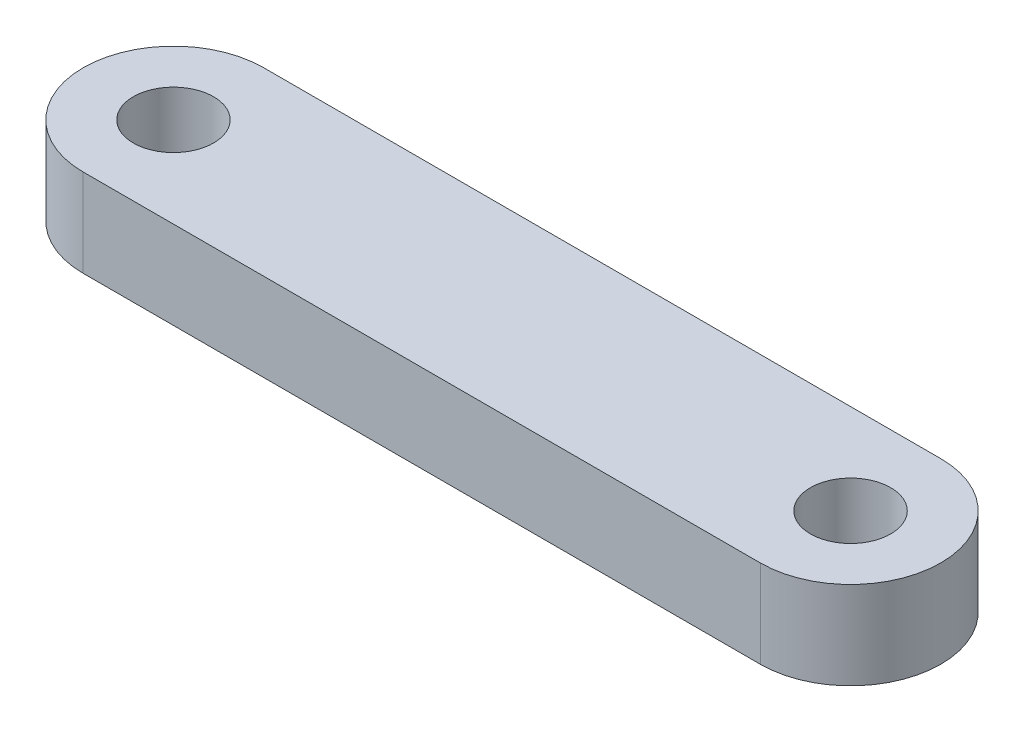
ISO-10303-21;
HEADER;
FILE_DESCRIPTION(('STEP AP214'),'2;1');
FILE_NAME('part.step','',(''),(''),'','','');
FILE_SCHEMA(('AUTOMOTIVE_DESIGN { 1 0 10303 214 1 1 1 1 }'));
ENDSEC;
DATA;
#1=APPLICATION_CONTEXT('core data for automotive mechanical design processes');
#2=APPLICATION_PROTOCOL_DEFINITION('international standard','automotive_design',2000,#1);
#3=PRODUCT_CONTEXT('',#1,'mechanical');
#4=PRODUCT('Part','Part','',(#3));
#5=PRODUCT_RELATED_PRODUCT_CATEGORY('part','',(#4));
#6=PRODUCT_DEFINITION_FORMATION('','',#4);
#7=PRODUCT_DEFINITION_CONTEXT('part definition',#1,'design');
#8=PRODUCT_DEFINITION('design','',#6,#7);
#9=PRODUCT_DEFINITION_SHAPE('','',#8);
#10=(LENGTH_UNIT() NAMED_UNIT(*) SI_UNIT(.MILLI.,.METRE.));
#11=(NAMED_UNIT(*) PLANE_ANGLE_UNIT() SI_UNIT($,.RADIAN.));
#12=(NAMED_UNIT(*) SI_UNIT($,.STERADIAN.) SOLID_ANGLE_UNIT());
#13=UNCERTAINTY_MEASURE_WITH_UNIT(LENGTH_MEASURE(1.E-05),#10,'distance_accuracy_value','');
#14=(GEOMETRIC_REPRESENTATION_CONTEXT(3) GLOBAL_UNCERTAINTY_ASSIGNED_CONTEXT((#13)) GLOBAL_UNIT_ASSIGNED_CONTEXT((#10,
#11,#12)) REPRESENTATION_CONTEXT('',''));
#15=CARTESIAN_POINT('',(0.,0.,0.));
#16=DIRECTION('',(0.,0.,1.));
#17=DIRECTION('',(1.,0.,0.));
#18=AXIS2_PLACEMENT_3D('',#15,#16,#17);
#19=CARTESIAN_POINT('',(0.,3.5,0.));
#20=DIRECTION('',(0.,1.,0.));
#21=DIRECTION('',(0.,0.,1.));
#22=AXIS2_PLACEMENT_3D('',#19,#20,#21);
#23=PLANE('',#22);
#24=CARTESIAN_POINT('',(0.,3.5,0.));
#25=DIRECTION('',(0.,1.,0.));
#26=DIRECTION('',(0.,0.,1.));
#27=AXIS2_PLACEMENT_3D('',#24,#25,#26);
#28=CIRCLE('',#27,1.6);
#29=CARTESIAN_POINT('',(0.,3.5,1.6));
#30=VERTEX_POINT('',#29);
#31=EDGE_CURVE('E99',#30,#30,#28,.T.);
#32=ORIENTED_EDGE('',*,*,#31,.F.);
#33=EDGE_LOOP('',(#32));
#34=FACE_BOUND('',#33,.T.);
#35=CARTESIAN_POINT('',(0.,3.5,0.));
#36=DIRECTION('',(0.,1.,0.));
#37=DIRECTION('',(0.,0.,1.));
#38=AXIS2_PLACEMENT_3D('',#35,#36,#37);
#39=CIRCLE('',#38,3.6);
#40=CARTESIAN_POINT('',(0.,3.5,3.6));
#41=VERTEX_POINT('',#40);
#42=CARTESIAN_POINT('',(0.,3.5,-3.6));
#43=VERTEX_POINT('',#42);
#44=EDGE_CURVE('E84',#41,#43,#39,.T.);
#45=ORIENTED_EDGE('',*,*,#44,.T.);
#46=DIRECTION('',(-1.,0.,0.));
#47=VECTOR('',#46,1.);
#48=CARTESIAN_POINT('',(-27.,3.5,-3.6));
#49=LINE('',#48,#47);
#50=CARTESIAN_POINT('',(-27.,3.5,-3.6));
#51=VERTEX_POINT('',#50);
#52=EDGE_CURVE('E79',#43,#51,#49,.T.);
#53=ORIENTED_EDGE('',*,*,#52,.T.);
#54=CARTESIAN_POINT('',(-27.,3.5,0.));
#55=DIRECTION('',(0.,1.,0.));
#56=DIRECTION('',(0.,0.,1.));
#57=AXIS2_PLACEMENT_3D('',#54,#55,#56);
#58=CIRCLE('',#57,3.6);
#59=CARTESIAN_POINT('',(-27.,3.5,3.6));
#60=VERTEX_POINT('',#59);
#61=EDGE_CURVE('E82',#51,#60,#58,.T.);
#62=ORIENTED_EDGE('',*,*,#61,.T.);
#63=DIRECTION('',(1.,0.,0.));
#64=VECTOR('',#63,1.);
#65=CARTESIAN_POINT('',(0.,3.5,3.6));
#66=LINE('',#65,#64);
#67=EDGE_CURVE('E49',#60,#41,#66,.T.);
#68=ORIENTED_EDGE('',*,*,#67,.T.);
#69=EDGE_LOOP('',(#45,#53,#62,#68));
#70=FACE_BOUND('',#69,.T.);
#71=CARTESIAN_POINT('',(-27.,3.5,0.));
#72=DIRECTION('',(0.,1.,0.));
#73=DIRECTION('',(0.,0.,1.));
#74=AXIS2_PLACEMENT_3D('',#71,#72,#73);
#75=CIRCLE('',#74,1.6);
#76=CARTESIAN_POINT('',(-27.,3.5,1.6));
#77=VERTEX_POINT('',#76);
#78=EDGE_CURVE('E114',#77,#77,#75,.T.);
#79=ORIENTED_EDGE('',*,*,#78,.F.);
#80=EDGE_LOOP('',(#79));
#81=FACE_BOUND('',#80,.T.);
#82=ADVANCED_FACE('F32',(#34,#70,#81),#23,.T.);
#83=CARTESIAN_POINT('',(0.,0.,0.));
#84=DIRECTION('',(0.,1.,0.));
#85=DIRECTION('',(0.,0.,1.));
#86=AXIS2_PLACEMENT_3D('',#83,#84,#85);
#87=PLANE('',#86);
#88=CARTESIAN_POINT('',(0.,0.,0.));
#89=DIRECTION('',(0.,1.,0.));
#90=DIRECTION('',(0.,0.,1.));
#91=AXIS2_PLACEMENT_3D('',#88,#89,#90);
#92=CIRCLE('',#91,3.6);
#93=CARTESIAN_POINT('',(0.,0.,3.6));
#94=VERTEX_POINT('',#93);
#95=CARTESIAN_POINT('',(0.,0.,-3.6));
#96=VERTEX_POINT('',#95);
#97=EDGE_CURVE('E96',#94,#96,#92,.T.);
#98=ORIENTED_EDGE('',*,*,#97,.F.);
#99=DIRECTION('',(1.,0.,0.));
#100=VECTOR('',#99,1.);
#101=CARTESIAN_POINT('',(0.,0.,3.6));
#102=LINE('',#101,#100);
#103=CARTESIAN_POINT('',(-27.,0.,3.6));
#104=VERTEX_POINT('',#103);
#105=EDGE_CURVE('E72',#104,#94,#102,.T.);
#106=ORIENTED_EDGE('',*,*,#105,.F.);
#107=CARTESIAN_POINT('',(-27.,0.,0.));
#108=DIRECTION('',(0.,1.,0.));
#109=DIRECTION('',(0.,0.,1.));
#110=AXIS2_PLACEMENT_3D('',#107,#108,#109);
#111=CIRCLE('',#110,3.6);
#112=CARTESIAN_POINT('',(-27.,0.,-3.6));
#113=VERTEX_POINT('',#112);
#114=EDGE_CURVE('E66',#113,#104,#111,.T.);
#115=ORIENTED_EDGE('',*,*,#114,.F.);
#116=DIRECTION('',(-1.,0.,0.));
#117=VECTOR('',#116,1.);
#118=CARTESIAN_POINT('',(-27.,0.,-3.6));
#119=LINE('',#118,#117);
#120=EDGE_CURVE('E88',#96,#113,#119,.T.);
#121=ORIENTED_EDGE('',*,*,#120,.F.);
#122=EDGE_LOOP('',(#98,#106,#115,#121));
#123=FACE_BOUND('',#122,.T.);
#124=CARTESIAN_POINT('',(0.,0.,0.));
#125=DIRECTION('',(0.,1.,0.));
#126=DIRECTION('',(0.,0.,1.));
#127=AXIS2_PLACEMENT_3D('',#124,#125,#126);
#128=CIRCLE('',#127,1.6);
#129=CARTESIAN_POINT('',(0.,0.,1.6));
#130=VERTEX_POINT('',#129);
#131=EDGE_CURVE('E111',#130,#130,#128,.T.);
#132=ORIENTED_EDGE('',*,*,#131,.T.);
#133=EDGE_LOOP('',(#132));
#134=FACE_BOUND('',#133,.T.);
#135=CARTESIAN_POINT('',(-27.,0.,0.));
#136=DIRECTION('',(0.,1.,0.));
#137=DIRECTION('',(0.,0.,1.));
#138=AXIS2_PLACEMENT_3D('',#135,#136,#137);
#139=CIRCLE('',#138,1.6);
#140=CARTESIAN_POINT('',(-27.,0.,1.6));
#141=VERTEX_POINT('',#140);
#142=EDGE_CURVE('E117',#141,#141,#139,.T.);
#143=ORIENTED_EDGE('',*,*,#142,.T.);
#144=EDGE_LOOP('',(#143));
#145=FACE_BOUND('',#144,.T.);
#146=ADVANCED_FACE('F107',(#123,#134,#145),#87,.F.);
#147=CARTESIAN_POINT('',(0.,3.5,0.));
#148=DIRECTION('',(0.,-1.,0.));
#149=DIRECTION('',(0.,0.,-1.));
#150=AXIS2_PLACEMENT_3D('',#147,#148,#149);
#151=CYLINDRICAL_SURFACE('',#150,3.6);
#152=ORIENTED_EDGE('',*,*,#97,.T.);
#153=DIRECTION('',(0.,-1.,0.));
#154=VECTOR('',#153,1.);
#155=CARTESIAN_POINT('',(0.,3.5,-3.6));
#156=LINE('',#155,#154);
#157=EDGE_CURVE('E11',#43,#96,#156,.T.);
#158=ORIENTED_EDGE('',*,*,#157,.F.);
#159=ORIENTED_EDGE('',*,*,#44,.F.);
#160=DIRECTION('',(0.,-1.,0.));
#161=VECTOR('',#160,1.);
#162=CARTESIAN_POINT('',(0.,3.5,3.6));
#163=LINE('',#162,#161);
#164=EDGE_CURVE('E92',#41,#94,#163,.T.);
#165=ORIENTED_EDGE('',*,*,#164,.T.);
#166=EDGE_LOOP('',(#152,#158,#159,#165));
#167=FACE_BOUND('',#166,.T.);
#168=ADVANCED_FACE('F34',(#167),#151,.T.);
#169=CARTESIAN_POINT('',(-27.,3.5,-3.6));
#170=DIRECTION('',(0.,0.,1.));
#171=DIRECTION('',(1.,0.,0.));
#172=AXIS2_PLACEMENT_3D('',#169,#170,#171);
#173=PLANE('',#172);
#174=ORIENTED_EDGE('',*,*,#120,.T.);
#175=DIRECTION('',(0.,-1.,0.));
#176=VECTOR('',#175,1.);
#177=CARTESIAN_POINT('',(-27.,3.5,-3.6));
#178=LINE('',#177,#176);
#179=EDGE_CURVE('E41',#51,#113,#178,.T.);
#180=ORIENTED_EDGE('',*,*,#179,.F.);
#181=ORIENTED_EDGE('',*,*,#52,.F.);
#182=ORIENTED_EDGE('',*,*,#157,.T.);
#183=EDGE_LOOP('',(#174,#180,#181,#182));
#184=FACE_BOUND('',#183,.T.);
#185=ADVANCED_FACE('F87',(#184),#173,.F.);
#186=CARTESIAN_POINT('',(-27.,3.5,0.));
#187=DIRECTION('',(0.,-1.,0.));
#188=DIRECTION('',(0.,0.,-1.));
#189=AXIS2_PLACEMENT_3D('',#186,#187,#188);
#190=CYLINDRICAL_SURFACE('',#189,3.6);
#191=ORIENTED_EDGE('',*,*,#114,.T.);
#192=DIRECTION('',(0.,-1.,0.));
#193=VECTOR('',#192,1.);
#194=CARTESIAN_POINT('',(-27.,3.5,3.6));
#195=LINE('',#194,#193);
#196=EDGE_CURVE('E89',#60,#104,#195,.T.);
#197=ORIENTED_EDGE('',*,*,#196,.F.);
#198=ORIENTED_EDGE('',*,*,#61,.F.);
#199=ORIENTED_EDGE('',*,*,#179,.T.);
#200=EDGE_LOOP('',(#191,#197,#198,#199));
#201=FACE_BOUND('',#200,.T.);
#202=ADVANCED_FACE('F90',(#201),#190,.T.);
#203=CARTESIAN_POINT('',(0.,3.5,3.6));
#204=DIRECTION('',(0.,0.,-1.));
#205=DIRECTION('',(-1.,0.,0.));
#206=AXIS2_PLACEMENT_3D('',#203,#204,#205);
#207=PLANE('',#206);
#208=ORIENTED_EDGE('',*,*,#105,.T.);
#209=ORIENTED_EDGE('',*,*,#164,.F.);
#210=ORIENTED_EDGE('',*,*,#67,.F.);
#211=ORIENTED_EDGE('',*,*,#196,.T.);
#212=EDGE_LOOP('',(#208,#209,#210,#211));
#213=FACE_BOUND('',#212,.T.);
#214=ADVANCED_FACE('F104',(#213),#207,.F.);
#215=CARTESIAN_POINT('',(0.,3.5,0.));
#216=DIRECTION('',(0.,-1.,0.));
#217=DIRECTION('',(0.,0.,-1.));
#218=AXIS2_PLACEMENT_3D('',#215,#216,#217);
#219=CYLINDRICAL_SURFACE('',#218,1.6);
#220=ORIENTED_EDGE('',*,*,#31,.T.);
#221=EDGE_LOOP('',(#220));
#222=FACE_BOUND('',#221,.T.);
#223=ORIENTED_EDGE('',*,*,#131,.F.);
#224=EDGE_LOOP('',(#223));
#225=FACE_BOUND('',#224,.T.);
#226=ADVANCED_FACE('F134',(#222,#225),#219,.F.);
#227=CARTESIAN_POINT('',(-27.,3.5,0.));
#228=DIRECTION('',(0.,-1.,0.));
#229=DIRECTION('',(0.,0.,-1.));
#230=AXIS2_PLACEMENT_3D('',#227,#228,#229);
#231=CYLINDRICAL_SURFACE('',#230,1.6);
#232=ORIENTED_EDGE('',*,*,#78,.T.);
#233=EDGE_LOOP('',(#232));
#234=FACE_BOUND('',#233,.T.);
#235=ORIENTED_EDGE('',*,*,#142,.F.);
#236=EDGE_LOOP('',(#235));
#237=FACE_BOUND('',#236,.T.);
#238=ADVANCED_FACE('F123',(#234,#237),#231,.F.);
#239=CLOSED_SHELL('',(#82,#146,#168,#185,#202,#214,#226,#238));
#240=MANIFOLD_SOLID_BREP('B2',#239);
#241=ADVANCED_BREP_SHAPE_REPRESENTATION('',(#18,#240),#14);
#242=SHAPE_DEFINITION_REPRESENTATION(#9,#241);
ENDSEC;
END-ISO-10303-21;
